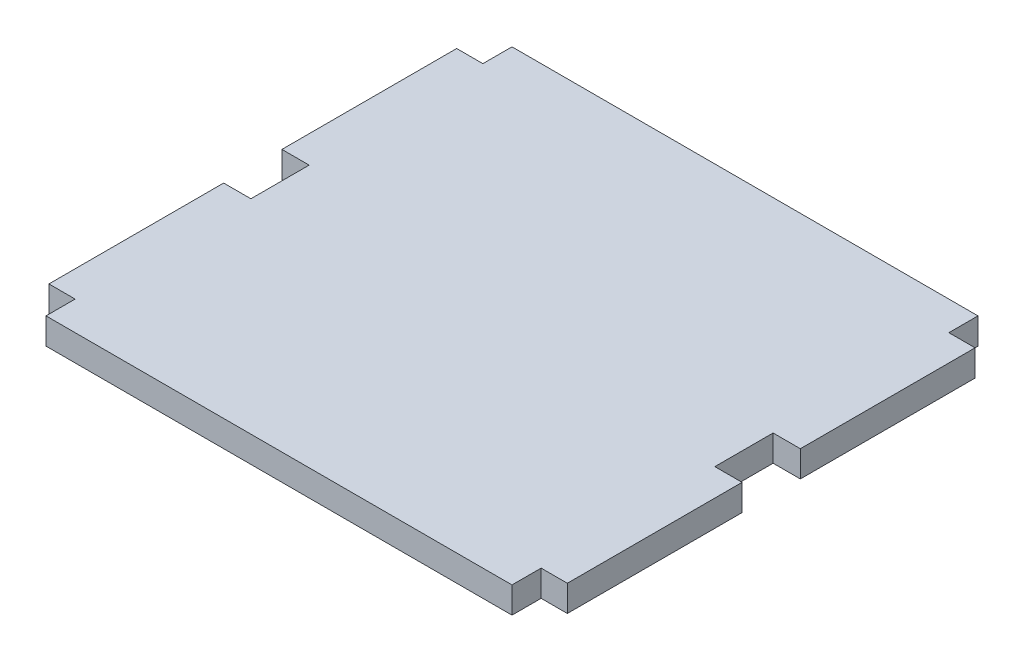
ISO-10303-21;
HEADER;
FILE_DESCRIPTION(('STEP AP214'),'2;1');
FILE_NAME('part.step','',(''),(''),'','','');
FILE_SCHEMA(('AUTOMOTIVE_DESIGN { 1 0 10303 214 1 1 1 1 }'));
ENDSEC;
DATA;
#1=APPLICATION_CONTEXT('core data for automotive mechanical design processes');
#2=APPLICATION_PROTOCOL_DEFINITION('international standard','automotive_design',2000,#1);
#3=PRODUCT_CONTEXT('',#1,'mechanical');
#4=PRODUCT('Part','Part','',(#3));
#5=PRODUCT_RELATED_PRODUCT_CATEGORY('part','',(#4));
#6=PRODUCT_DEFINITION_FORMATION('','',#4);
#7=PRODUCT_DEFINITION_CONTEXT('part definition',#1,'design');
#8=PRODUCT_DEFINITION('design','',#6,#7);
#9=PRODUCT_DEFINITION_SHAPE('','',#8);
#10=(LENGTH_UNIT() NAMED_UNIT(*) SI_UNIT(.MILLI.,.METRE.));
#11=(NAMED_UNIT(*) PLANE_ANGLE_UNIT() SI_UNIT($,.RADIAN.));
#12=(NAMED_UNIT(*) SI_UNIT($,.STERADIAN.) SOLID_ANGLE_UNIT());
#13=UNCERTAINTY_MEASURE_WITH_UNIT(LENGTH_MEASURE(1.E-05),#10,'distance_accuracy_value','');
#14=(GEOMETRIC_REPRESENTATION_CONTEXT(3) GLOBAL_UNCERTAINTY_ASSIGNED_CONTEXT((#13)) GLOBAL_UNIT_ASSIGNED_CONTEXT((#10,
#11,#12)) REPRESENTATION_CONTEXT('',''));
#15=CARTESIAN_POINT('',(0.,0.,0.));
#16=DIRECTION('',(0.,0.,1.));
#17=DIRECTION('',(1.,0.,0.));
#18=AXIS2_PLACEMENT_3D('',#15,#16,#17);
#19=CARTESIAN_POINT('',(-44.5,4.5,0.));
#20=DIRECTION('',(-1.,0.,0.));
#21=DIRECTION('',(0.,0.,1.));
#22=AXIS2_PLACEMENT_3D('',#19,#20,#21);
#23=PLANE('',#22);
#24=DIRECTION('',(0.,0.,-1.));
#25=VECTOR('',#24,1.);
#26=CARTESIAN_POINT('',(-44.5,0.,0.));
#27=LINE('',#26,#25);
#28=CARTESIAN_POINT('',(-44.5,0.,-5.));
#29=VERTEX_POINT('',#28);
#30=CARTESIAN_POINT('',(-44.5,0.,-35.));
#31=VERTEX_POINT('',#30);
#32=EDGE_CURVE('E212',#29,#31,#27,.T.);
#33=ORIENTED_EDGE('',*,*,#32,.F.);
#34=DIRECTION('',(0.,-1.,0.));
#35=VECTOR('',#34,1.);
#36=CARTESIAN_POINT('',(-44.5,4.5,-5.));
#37=LINE('',#36,#35);
#38=CARTESIAN_POINT('',(-44.5,4.5,-5.));
#39=VERTEX_POINT('',#38);
#40=EDGE_CURVE('E11',#39,#29,#37,.T.);
#41=ORIENTED_EDGE('',*,*,#40,.F.);
#42=DIRECTION('',(0.,0.,-1.));
#43=VECTOR('',#42,1.);
#44=CARTESIAN_POINT('',(-44.5,4.5,0.));
#45=LINE('',#44,#43);
#46=CARTESIAN_POINT('',(-44.5,4.5,-35.));
#47=VERTEX_POINT('',#46);
#48=EDGE_CURVE('E283',#39,#47,#45,.T.);
#49=ORIENTED_EDGE('',*,*,#48,.T.);
#50=DIRECTION('',(0.,-1.,0.));
#51=VECTOR('',#50,1.);
#52=CARTESIAN_POINT('',(-44.5,4.5,-35.));
#53=LINE('',#52,#51);
#54=EDGE_CURVE('E56',#47,#31,#53,.T.);
#55=ORIENTED_EDGE('',*,*,#54,.T.);
#56=EDGE_LOOP('',(#33,#41,#49,#55));
#57=FACE_BOUND('',#56,.T.);
#58=ADVANCED_FACE('F39',(#57),#23,.T.);
#59=CARTESIAN_POINT('',(0.,4.5,-5.));
#60=DIRECTION('',(0.,0.,-1.));
#61=DIRECTION('',(-1.,0.,0.));
#62=AXIS2_PLACEMENT_3D('',#59,#60,#61);
#63=PLANE('',#62);
#64=DIRECTION('',(1.,0.,0.));
#65=VECTOR('',#64,1.);
#66=CARTESIAN_POINT('',(0.,0.,-5.));
#67=LINE('',#66,#65);
#68=CARTESIAN_POINT('',(-39.8241412720848,0.,-5.));
#69=VERTEX_POINT('',#68);
#70=EDGE_CURVE('E215',#29,#69,#67,.T.);
#71=ORIENTED_EDGE('',*,*,#70,.T.);
#72=DIRECTION('',(0.,-1.,0.));
#73=VECTOR('',#72,1.);
#74=CARTESIAN_POINT('',(-39.8241412720848,4.5,-5.));
#75=LINE('',#74,#73);
#76=CARTESIAN_POINT('',(-39.8241412720848,4.5,-5.));
#77=VERTEX_POINT('',#76);
#78=EDGE_CURVE('E48',#77,#69,#75,.T.);
#79=ORIENTED_EDGE('',*,*,#78,.F.);
#80=DIRECTION('',(1.,0.,0.));
#81=VECTOR('',#80,1.);
#82=CARTESIAN_POINT('',(0.,4.5,-5.));
#83=LINE('',#82,#81);
#84=EDGE_CURVE('E365',#39,#77,#83,.T.);
#85=ORIENTED_EDGE('',*,*,#84,.F.);
#86=ORIENTED_EDGE('',*,*,#40,.T.);
#87=EDGE_LOOP('',(#71,#79,#85,#86));
#88=FACE_BOUND('',#87,.T.);
#89=ADVANCED_FACE('F423',(#88),#63,.F.);
#90=CARTESIAN_POINT('',(-39.8241412720814,4.5,2.75782820118983E-11));
#91=DIRECTION('',(1.,0.,-6.92501611609941E-13));
#92=DIRECTION('',(-6.92501611609941E-13,0.,-1.));
#93=AXIS2_PLACEMENT_3D('',#90,#91,#92);
#94=PLANE('',#93);
#95=DIRECTION('',(6.92501611609941E-13,0.,1.));
#96=VECTOR('',#95,1.);
#97=CARTESIAN_POINT('',(-39.8241412720814,0.,2.75782820118983E-11));
#98=LINE('',#97,#96);
#99=CARTESIAN_POINT('',(-39.8241412720848,0.,5.));
#100=VERTEX_POINT('',#99);
#101=EDGE_CURVE('E218',#69,#100,#98,.T.);
#102=ORIENTED_EDGE('',*,*,#101,.T.);
#103=DIRECTION('',(0.,-1.,0.));
#104=VECTOR('',#103,1.);
#105=CARTESIAN_POINT('',(-39.8241412720848,4.5,5.));
#106=LINE('',#105,#104);
#107=CARTESIAN_POINT('',(-39.8241412720848,4.5,5.));
#108=VERTEX_POINT('',#107);
#109=EDGE_CURVE('E333',#108,#100,#106,.T.);
#110=ORIENTED_EDGE('',*,*,#109,.F.);
#111=DIRECTION('',(6.92501611609941E-13,0.,1.));
#112=VECTOR('',#111,1.);
#113=CARTESIAN_POINT('',(-39.8241412720814,4.5,2.75782820118983E-11));
#114=LINE('',#113,#112);
#115=EDGE_CURVE('E343',#77,#108,#114,.T.);
#116=ORIENTED_EDGE('',*,*,#115,.F.);
#117=ORIENTED_EDGE('',*,*,#78,.T.);
#118=EDGE_LOOP('',(#102,#110,#116,#117));
#119=FACE_BOUND('',#118,.T.);
#120=ADVANCED_FACE('F341',(#119),#94,.F.);
#121=CARTESIAN_POINT('',(0.,4.5,4.99999999999997));
#122=DIRECTION('',(0.,0.,-1.));
#123=DIRECTION('',(-1.,0.,0.));
#124=AXIS2_PLACEMENT_3D('',#121,#122,#123);
#125=PLANE('',#124);
#126=DIRECTION('',(1.,0.,0.));
#127=VECTOR('',#126,1.);
#128=CARTESIAN_POINT('',(0.,0.,4.99999999999997));
#129=LINE('',#128,#127);
#130=CARTESIAN_POINT('',(-44.5,0.,5.));
#131=VERTEX_POINT('',#130);
#132=EDGE_CURVE('E222',#131,#100,#129,.T.);
#133=ORIENTED_EDGE('',*,*,#132,.F.);
#134=DIRECTION('',(0.,-1.,0.));
#135=VECTOR('',#134,1.);
#136=CARTESIAN_POINT('',(-44.5,4.5,5.));
#137=LINE('',#136,#135);
#138=CARTESIAN_POINT('',(-44.5,4.5,5.));
#139=VERTEX_POINT('',#138);
#140=EDGE_CURVE('E330',#139,#131,#137,.T.);
#141=ORIENTED_EDGE('',*,*,#140,.F.);
#142=DIRECTION('',(1.,0.,0.));
#143=VECTOR('',#142,1.);
#144=CARTESIAN_POINT('',(0.,4.5,4.99999999999997));
#145=LINE('',#144,#143);
#146=EDGE_CURVE('E355',#139,#108,#145,.T.);
#147=ORIENTED_EDGE('',*,*,#146,.T.);
#148=ORIENTED_EDGE('',*,*,#109,.T.);
#149=EDGE_LOOP('',(#133,#141,#147,#148));
#150=FACE_BOUND('',#149,.T.);
#151=ADVANCED_FACE('F352',(#150),#125,.T.);
#152=CARTESIAN_POINT('',(-44.5,4.5,0.));
#153=DIRECTION('',(-1.,0.,0.));
#154=DIRECTION('',(0.,0.,1.));
#155=AXIS2_PLACEMENT_3D('',#152,#153,#154);
#156=PLANE('',#155);
#157=DIRECTION('',(0.,0.,-1.));
#158=VECTOR('',#157,1.);
#159=CARTESIAN_POINT('',(-44.5,0.,0.));
#160=LINE('',#159,#158);
#161=CARTESIAN_POINT('',(-44.5,0.,35.));
#162=VERTEX_POINT('',#161);
#163=EDGE_CURVE('E226',#162,#131,#160,.T.);
#164=ORIENTED_EDGE('',*,*,#163,.F.);
#165=DIRECTION('',(0.,-1.,0.));
#166=VECTOR('',#165,1.);
#167=CARTESIAN_POINT('',(-44.5,4.5,35.));
#168=LINE('',#167,#166);
#169=CARTESIAN_POINT('',(-44.5,4.5,35.));
#170=VERTEX_POINT('',#169);
#171=EDGE_CURVE('E327',#170,#162,#168,.T.);
#172=ORIENTED_EDGE('',*,*,#171,.F.);
#173=DIRECTION('',(0.,0.,-1.));
#174=VECTOR('',#173,1.);
#175=CARTESIAN_POINT('',(-44.5,4.5,0.));
#176=LINE('',#175,#174);
#177=EDGE_CURVE('E359',#170,#139,#176,.T.);
#178=ORIENTED_EDGE('',*,*,#177,.T.);
#179=ORIENTED_EDGE('',*,*,#140,.T.);
#180=EDGE_LOOP('',(#164,#172,#178,#179));
#181=FACE_BOUND('',#180,.T.);
#182=ADVANCED_FACE('F434',(#181),#156,.T.);
#183=CARTESIAN_POINT('',(0.,4.5,35.));
#184=DIRECTION('',(0.,0.,-1.));
#185=DIRECTION('',(-1.,0.,0.));
#186=AXIS2_PLACEMENT_3D('',#183,#184,#185);
#187=PLANE('',#186);
#188=DIRECTION('',(1.,0.,0.));
#189=VECTOR('',#188,1.);
#190=CARTESIAN_POINT('',(0.,0.,35.));
#191=LINE('',#190,#189);
#192=CARTESIAN_POINT('',(-40.,0.,35.));
#193=VERTEX_POINT('',#192);
#194=EDGE_CURVE('E230',#162,#193,#191,.T.);
#195=ORIENTED_EDGE('',*,*,#194,.T.);
#196=DIRECTION('',(0.,-1.,0.));
#197=VECTOR('',#196,1.);
#198=CARTESIAN_POINT('',(-40.,4.5,35.));
#199=LINE('',#198,#197);
#200=CARTESIAN_POINT('',(-40.,4.5,35.));
#201=VERTEX_POINT('',#200);
#202=EDGE_CURVE('E324',#201,#193,#199,.T.);
#203=ORIENTED_EDGE('',*,*,#202,.F.);
#204=DIRECTION('',(1.,0.,0.));
#205=VECTOR('',#204,1.);
#206=CARTESIAN_POINT('',(0.,4.5,35.));
#207=LINE('',#206,#205);
#208=EDGE_CURVE('E363',#170,#201,#207,.T.);
#209=ORIENTED_EDGE('',*,*,#208,.F.);
#210=ORIENTED_EDGE('',*,*,#171,.T.);
#211=EDGE_LOOP('',(#195,#203,#209,#210));
#212=FACE_BOUND('',#211,.T.);
#213=ADVANCED_FACE('F437',(#212),#187,.F.);
#214=CARTESIAN_POINT('',(-40.,4.5,0.));
#215=DIRECTION('',(-1.,0.,0.));
#216=DIRECTION('',(0.,0.,1.));
#217=AXIS2_PLACEMENT_3D('',#214,#215,#216);
#218=PLANE('',#217);
#219=DIRECTION('',(0.,0.,-1.));
#220=VECTOR('',#219,1.);
#221=CARTESIAN_POINT('',(-40.,0.,0.));
#222=LINE('',#221,#220);
#223=CARTESIAN_POINT('',(-40.,0.,40.));
#224=VERTEX_POINT('',#223);
#225=EDGE_CURVE('E234',#224,#193,#222,.T.);
#226=ORIENTED_EDGE('',*,*,#225,.F.);
#227=DIRECTION('',(0.,-1.,0.));
#228=VECTOR('',#227,1.);
#229=CARTESIAN_POINT('',(-40.,4.5,40.));
#230=LINE('',#229,#228);
#231=CARTESIAN_POINT('',(-40.,4.5,40.));
#232=VERTEX_POINT('',#231);
#233=EDGE_CURVE('E321',#232,#224,#230,.T.);
#234=ORIENTED_EDGE('',*,*,#233,.F.);
#235=DIRECTION('',(0.,0.,-1.));
#236=VECTOR('',#235,1.);
#237=CARTESIAN_POINT('',(-40.,4.5,0.));
#238=LINE('',#237,#236);
#239=EDGE_CURVE('E371',#232,#201,#238,.T.);
#240=ORIENTED_EDGE('',*,*,#239,.T.);
#241=ORIENTED_EDGE('',*,*,#202,.T.);
#242=EDGE_LOOP('',(#226,#234,#240,#241));
#243=FACE_BOUND('',#242,.T.);
#244=ADVANCED_FACE('F441',(#243),#218,.T.);
#245=CARTESIAN_POINT('',(0.,4.5,40.));
#246=DIRECTION('',(0.,0.,-1.));
#247=DIRECTION('',(-1.,0.,0.));
#248=AXIS2_PLACEMENT_3D('',#245,#246,#247);
#249=PLANE('',#248);
#250=DIRECTION('',(1.,0.,0.));
#251=VECTOR('',#250,1.);
#252=CARTESIAN_POINT('',(0.,0.,40.));
#253=LINE('',#252,#251);
#254=CARTESIAN_POINT('',(40.,0.,40.));
#255=VERTEX_POINT('',#254);
#256=EDGE_CURVE('E238',#224,#255,#253,.T.);
#257=ORIENTED_EDGE('',*,*,#256,.T.);
#258=DIRECTION('',(0.,-1.,0.));
#259=VECTOR('',#258,1.);
#260=CARTESIAN_POINT('',(40.,4.5,40.));
#261=LINE('',#260,#259);
#262=CARTESIAN_POINT('',(40.,4.5,40.));
#263=VERTEX_POINT('',#262);
#264=EDGE_CURVE('E317',#263,#255,#261,.T.);
#265=ORIENTED_EDGE('',*,*,#264,.F.);
#266=DIRECTION('',(1.,0.,0.));
#267=VECTOR('',#266,1.);
#268=CARTESIAN_POINT('',(0.,4.5,40.));
#269=LINE('',#268,#267);
#270=EDGE_CURVE('E375',#232,#263,#269,.T.);
#271=ORIENTED_EDGE('',*,*,#270,.F.);
#272=ORIENTED_EDGE('',*,*,#233,.T.);
#273=EDGE_LOOP('',(#257,#265,#271,#272));
#274=FACE_BOUND('',#273,.T.);
#275=ADVANCED_FACE('F445',(#274),#249,.F.);
#276=CARTESIAN_POINT('',(40.,4.5,0.));
#277=DIRECTION('',(-1.,0.,0.));
#278=DIRECTION('',(0.,0.,1.));
#279=AXIS2_PLACEMENT_3D('',#276,#277,#278);
#280=PLANE('',#279);
#281=DIRECTION('',(0.,0.,-1.));
#282=VECTOR('',#281,1.);
#283=CARTESIAN_POINT('',(40.,0.,0.));
#284=LINE('',#283,#282);
#285=CARTESIAN_POINT('',(40.,0.,35.));
#286=VERTEX_POINT('',#285);
#287=EDGE_CURVE('E241',#255,#286,#284,.T.);
#288=ORIENTED_EDGE('',*,*,#287,.T.);
#289=DIRECTION('',(0.,-1.,0.));
#290=VECTOR('',#289,1.);
#291=CARTESIAN_POINT('',(40.,4.5,35.));
#292=LINE('',#291,#290);
#293=CARTESIAN_POINT('',(40.,4.5,35.));
#294=VERTEX_POINT('',#293);
#295=EDGE_CURVE('E314',#294,#286,#292,.T.);
#296=ORIENTED_EDGE('',*,*,#295,.F.);
#297=DIRECTION('',(0.,0.,-1.));
#298=VECTOR('',#297,1.);
#299=CARTESIAN_POINT('',(40.,4.5,0.));
#300=LINE('',#299,#298);
#301=EDGE_CURVE('E378',#263,#294,#300,.T.);
#302=ORIENTED_EDGE('',*,*,#301,.F.);
#303=ORIENTED_EDGE('',*,*,#264,.T.);
#304=EDGE_LOOP('',(#288,#296,#302,#303));
#305=FACE_BOUND('',#304,.T.);
#306=ADVANCED_FACE('F449',(#305),#280,.F.);
#307=CARTESIAN_POINT('',(0.,4.5,35.));
#308=DIRECTION('',(0.,0.,1.));
#309=DIRECTION('',(1.,0.,0.));
#310=AXIS2_PLACEMENT_3D('',#307,#308,#309);
#311=PLANE('',#310);
#312=DIRECTION('',(-1.,0.,0.));
#313=VECTOR('',#312,1.);
#314=CARTESIAN_POINT('',(0.,0.,35.));
#315=LINE('',#314,#313);
#316=CARTESIAN_POINT('',(44.5,0.,35.));
#317=VERTEX_POINT('',#316);
#318=EDGE_CURVE('E245',#317,#286,#315,.T.);
#319=ORIENTED_EDGE('',*,*,#318,.F.);
#320=DIRECTION('',(0.,-1.,0.));
#321=VECTOR('',#320,1.);
#322=CARTESIAN_POINT('',(44.5,4.5,35.));
#323=LINE('',#322,#321);
#324=CARTESIAN_POINT('',(44.5,4.5,35.));
#325=VERTEX_POINT('',#324);
#326=EDGE_CURVE('E311',#325,#317,#323,.T.);
#327=ORIENTED_EDGE('',*,*,#326,.F.);
#328=DIRECTION('',(-1.,0.,0.));
#329=VECTOR('',#328,1.);
#330=CARTESIAN_POINT('',(0.,4.5,35.));
#331=LINE('',#330,#329);
#332=EDGE_CURVE('E381',#325,#294,#331,.T.);
#333=ORIENTED_EDGE('',*,*,#332,.T.);
#334=ORIENTED_EDGE('',*,*,#295,.T.);
#335=EDGE_LOOP('',(#319,#327,#333,#334));
#336=FACE_BOUND('',#335,.T.);
#337=ADVANCED_FACE('F453',(#336),#311,.T.);
#338=CARTESIAN_POINT('',(44.5,4.5,0.));
#339=DIRECTION('',(-1.,0.,0.));
#340=DIRECTION('',(0.,0.,1.));
#341=AXIS2_PLACEMENT_3D('',#338,#339,#340);
#342=PLANE('',#341);
#343=DIRECTION('',(0.,0.,-1.));
#344=VECTOR('',#343,1.);
#345=CARTESIAN_POINT('',(44.5,0.,0.));
#346=LINE('',#345,#344);
#347=CARTESIAN_POINT('',(44.5,0.,5.));
#348=VERTEX_POINT('',#347);
#349=EDGE_CURVE('E249',#317,#348,#346,.T.);
#350=ORIENTED_EDGE('',*,*,#349,.T.);
#351=DIRECTION('',(0.,-1.,0.));
#352=VECTOR('',#351,1.);
#353=CARTESIAN_POINT('',(44.5,4.5,5.));
#354=LINE('',#353,#352);
#355=CARTESIAN_POINT('',(44.5,4.5,5.));
#356=VERTEX_POINT('',#355);
#357=EDGE_CURVE('E307',#356,#348,#354,.T.);
#358=ORIENTED_EDGE('',*,*,#357,.F.);
#359=DIRECTION('',(0.,0.,-1.));
#360=VECTOR('',#359,1.);
#361=CARTESIAN_POINT('',(44.5,4.5,0.));
#362=LINE('',#361,#360);
#363=EDGE_CURVE('E385',#325,#356,#362,.T.);
#364=ORIENTED_EDGE('',*,*,#363,.F.);
#365=ORIENTED_EDGE('',*,*,#326,.T.);
#366=EDGE_LOOP('',(#350,#358,#364,#365));
#367=FACE_BOUND('',#366,.T.);
#368=ADVANCED_FACE('F457',(#367),#342,.F.);
#369=CARTESIAN_POINT('',(0.,4.5,4.99999999999997));
#370=DIRECTION('',(0.,0.,1.));
#371=DIRECTION('',(1.,0.,0.));
#372=AXIS2_PLACEMENT_3D('',#369,#370,#371);
#373=PLANE('',#372);
#374=DIRECTION('',(-1.,0.,0.));
#375=VECTOR('',#374,1.);
#376=CARTESIAN_POINT('',(0.,0.,4.99999999999997));
#377=LINE('',#376,#375);
#378=CARTESIAN_POINT('',(39.8241412720848,0.,5.));
#379=VERTEX_POINT('',#378);
#380=EDGE_CURVE('E252',#348,#379,#377,.T.);
#381=ORIENTED_EDGE('',*,*,#380,.T.);
#382=DIRECTION('',(0.,-1.,0.));
#383=VECTOR('',#382,1.);
#384=CARTESIAN_POINT('',(39.8241412720848,4.5,5.));
#385=LINE('',#384,#383);
#386=CARTESIAN_POINT('',(39.8241412720848,4.5,5.));
#387=VERTEX_POINT('',#386);
#388=EDGE_CURVE('E303',#387,#379,#385,.T.);
#389=ORIENTED_EDGE('',*,*,#388,.F.);
#390=DIRECTION('',(-1.,0.,0.));
#391=VECTOR('',#390,1.);
#392=CARTESIAN_POINT('',(0.,4.5,4.99999999999997));
#393=LINE('',#392,#391);
#394=EDGE_CURVE('E388',#356,#387,#393,.T.);
#395=ORIENTED_EDGE('',*,*,#394,.F.);
#396=ORIENTED_EDGE('',*,*,#357,.T.);
#397=EDGE_LOOP('',(#381,#389,#395,#396));
#398=FACE_BOUND('',#397,.T.);
#399=ADVANCED_FACE('F461',(#398),#373,.F.);
#400=CARTESIAN_POINT('',(39.8241412720814,4.5,-2.75782820118983E-11));
#401=DIRECTION('',(-1.,0.,6.92501611609941E-13));
#402=DIRECTION('',(6.92501611609941E-13,0.,1.));
#403=AXIS2_PLACEMENT_3D('',#400,#401,#402);
#404=PLANE('',#403);
#405=DIRECTION('',(-6.92501611609941E-13,0.,-1.));
#406=VECTOR('',#405,1.);
#407=CARTESIAN_POINT('',(39.8241412720814,0.,-2.75782820118983E-11));
#408=LINE('',#407,#406);
#409=CARTESIAN_POINT('',(39.8241412720848,0.,-5.));
#410=VERTEX_POINT('',#409);
#411=EDGE_CURVE('E255',#379,#410,#408,.T.);
#412=ORIENTED_EDGE('',*,*,#411,.T.);
#413=DIRECTION('',(0.,-1.,0.));
#414=VECTOR('',#413,1.);
#415=CARTESIAN_POINT('',(39.8241412720848,4.5,-5.));
#416=LINE('',#415,#414);
#417=CARTESIAN_POINT('',(39.8241412720848,4.5,-5.));
#418=VERTEX_POINT('',#417);
#419=EDGE_CURVE('E300',#418,#410,#416,.T.);
#420=ORIENTED_EDGE('',*,*,#419,.F.);
#421=DIRECTION('',(-6.92501611609941E-13,0.,-1.));
#422=VECTOR('',#421,1.);
#423=CARTESIAN_POINT('',(39.8241412720814,4.5,-2.75782820118983E-11));
#424=LINE('',#423,#422);
#425=EDGE_CURVE('E391',#387,#418,#424,.T.);
#426=ORIENTED_EDGE('',*,*,#425,.F.);
#427=ORIENTED_EDGE('',*,*,#388,.T.);
#428=EDGE_LOOP('',(#412,#420,#426,#427));
#429=FACE_BOUND('',#428,.T.);
#430=ADVANCED_FACE('F465',(#429),#404,.F.);
#431=CARTESIAN_POINT('',(0.,4.5,-5.));
#432=DIRECTION('',(0.,0.,1.));
#433=DIRECTION('',(1.,0.,0.));
#434=AXIS2_PLACEMENT_3D('',#431,#432,#433);
#435=PLANE('',#434);
#436=DIRECTION('',(-1.,0.,0.));
#437=VECTOR('',#436,1.);
#438=CARTESIAN_POINT('',(0.,0.,-5.));
#439=LINE('',#438,#437);
#440=CARTESIAN_POINT('',(44.5,0.,-5.));
#441=VERTEX_POINT('',#440);
#442=EDGE_CURVE('E259',#441,#410,#439,.T.);
#443=ORIENTED_EDGE('',*,*,#442,.F.);
#444=DIRECTION('',(0.,-1.,0.));
#445=VECTOR('',#444,1.);
#446=CARTESIAN_POINT('',(44.5,4.5,-5.));
#447=LINE('',#446,#445);
#448=CARTESIAN_POINT('',(44.5,4.5,-5.));
#449=VERTEX_POINT('',#448);
#450=EDGE_CURVE('E297',#449,#441,#447,.T.);
#451=ORIENTED_EDGE('',*,*,#450,.F.);
#452=DIRECTION('',(-1.,0.,0.));
#453=VECTOR('',#452,1.);
#454=CARTESIAN_POINT('',(0.,4.5,-5.));
#455=LINE('',#454,#453);
#456=EDGE_CURVE('E394',#449,#418,#455,.T.);
#457=ORIENTED_EDGE('',*,*,#456,.T.);
#458=ORIENTED_EDGE('',*,*,#419,.T.);
#459=EDGE_LOOP('',(#443,#451,#457,#458));
#460=FACE_BOUND('',#459,.T.);
#461=ADVANCED_FACE('F469',(#460),#435,.T.);
#462=CARTESIAN_POINT('',(44.5,4.5,0.));
#463=DIRECTION('',(-1.,0.,0.));
#464=DIRECTION('',(0.,0.,1.));
#465=AXIS2_PLACEMENT_3D('',#462,#463,#464);
#466=PLANE('',#465);
#467=DIRECTION('',(0.,0.,-1.));
#468=VECTOR('',#467,1.);
#469=CARTESIAN_POINT('',(44.5,0.,0.));
#470=LINE('',#469,#468);
#471=CARTESIAN_POINT('',(44.5,0.,-35.));
#472=VERTEX_POINT('',#471);
#473=EDGE_CURVE('E263',#441,#472,#470,.T.);
#474=ORIENTED_EDGE('',*,*,#473,.T.);
#475=DIRECTION('',(0.,-1.,0.));
#476=VECTOR('',#475,1.);
#477=CARTESIAN_POINT('',(44.5,4.5,-35.));
#478=LINE('',#477,#476);
#479=CARTESIAN_POINT('',(44.5,4.5,-35.));
#480=VERTEX_POINT('',#479);
#481=EDGE_CURVE('E293',#480,#472,#478,.T.);
#482=ORIENTED_EDGE('',*,*,#481,.F.);
#483=DIRECTION('',(0.,0.,-1.));
#484=VECTOR('',#483,1.);
#485=CARTESIAN_POINT('',(44.5,4.5,0.));
#486=LINE('',#485,#484);
#487=EDGE_CURVE('E398',#449,#480,#486,.T.);
#488=ORIENTED_EDGE('',*,*,#487,.F.);
#489=ORIENTED_EDGE('',*,*,#450,.T.);
#490=EDGE_LOOP('',(#474,#482,#488,#489));
#491=FACE_BOUND('',#490,.T.);
#492=ADVANCED_FACE('F473',(#491),#466,.F.);
#493=CARTESIAN_POINT('',(0.,4.5,-35.));
#494=DIRECTION('',(0.,0.,1.));
#495=DIRECTION('',(1.,0.,0.));
#496=AXIS2_PLACEMENT_3D('',#493,#494,#495);
#497=PLANE('',#496);
#498=DIRECTION('',(-1.,0.,0.));
#499=VECTOR('',#498,1.);
#500=CARTESIAN_POINT('',(0.,0.,-35.));
#501=LINE('',#500,#499);
#502=CARTESIAN_POINT('',(40.,0.,-35.));
#503=VERTEX_POINT('',#502);
#504=EDGE_CURVE('E266',#472,#503,#501,.T.);
#505=ORIENTED_EDGE('',*,*,#504,.T.);
#506=DIRECTION('',(0.,-1.,0.));
#507=VECTOR('',#506,1.);
#508=CARTESIAN_POINT('',(40.,4.5,-35.));
#509=LINE('',#508,#507);
#510=CARTESIAN_POINT('',(40.,4.5,-35.));
#511=VERTEX_POINT('',#510);
#512=EDGE_CURVE('E290',#511,#503,#509,.T.);
#513=ORIENTED_EDGE('',*,*,#512,.F.);
#514=DIRECTION('',(-1.,0.,0.));
#515=VECTOR('',#514,1.);
#516=CARTESIAN_POINT('',(0.,4.5,-35.));
#517=LINE('',#516,#515);
#518=EDGE_CURVE('E206',#480,#511,#517,.T.);
#519=ORIENTED_EDGE('',*,*,#518,.F.);
#520=ORIENTED_EDGE('',*,*,#481,.T.);
#521=EDGE_LOOP('',(#505,#513,#519,#520));
#522=FACE_BOUND('',#521,.T.);
#523=ADVANCED_FACE('F407',(#522),#497,.F.);
#524=CARTESIAN_POINT('',(40.,4.5,0.));
#525=DIRECTION('',(1.,0.,0.));
#526=DIRECTION('',(0.,0.,-1.));
#527=AXIS2_PLACEMENT_3D('',#524,#525,#526);
#528=PLANE('',#527);
#529=DIRECTION('',(0.,0.,1.));
#530=VECTOR('',#529,1.);
#531=CARTESIAN_POINT('',(40.,0.,0.));
#532=LINE('',#531,#530);
#533=CARTESIAN_POINT('',(40.,0.,-40.));
#534=VERTEX_POINT('',#533);
#535=EDGE_CURVE('E270',#534,#503,#532,.T.);
#536=ORIENTED_EDGE('',*,*,#535,.F.);
#537=DIRECTION('',(0.,-1.,0.));
#538=VECTOR('',#537,1.);
#539=CARTESIAN_POINT('',(40.,4.5,-40.));
#540=LINE('',#539,#538);
#541=CARTESIAN_POINT('',(40.,4.5,-40.));
#542=VERTEX_POINT('',#541);
#543=EDGE_CURVE('E189',#542,#534,#540,.T.);
#544=ORIENTED_EDGE('',*,*,#543,.F.);
#545=DIRECTION('',(0.,0.,1.));
#546=VECTOR('',#545,1.);
#547=CARTESIAN_POINT('',(40.,4.5,0.));
#548=LINE('',#547,#546);
#549=EDGE_CURVE('E202',#542,#511,#548,.T.);
#550=ORIENTED_EDGE('',*,*,#549,.T.);
#551=ORIENTED_EDGE('',*,*,#512,.T.);
#552=EDGE_LOOP('',(#536,#544,#550,#551));
#553=FACE_BOUND('',#552,.T.);
#554=ADVANCED_FACE('F411',(#553),#528,.T.);
#555=CARTESIAN_POINT('',(0.,4.5,-40.));
#556=DIRECTION('',(0.,0.,-1.));
#557=DIRECTION('',(-1.,0.,0.));
#558=AXIS2_PLACEMENT_3D('',#555,#556,#557);
#559=PLANE('',#558);
#560=DIRECTION('',(1.,0.,0.));
#561=VECTOR('',#560,1.);
#562=CARTESIAN_POINT('',(0.,0.,-40.));
#563=LINE('',#562,#561);
#564=CARTESIAN_POINT('',(-40.,0.,-40.));
#565=VERTEX_POINT('',#564);
#566=EDGE_CURVE('E185',#565,#534,#563,.T.);
#567=ORIENTED_EDGE('',*,*,#566,.F.);
#568=DIRECTION('',(0.,-1.,0.));
#569=VECTOR('',#568,1.);
#570=CARTESIAN_POINT('',(-40.,4.5,-40.));
#571=LINE('',#570,#569);
#572=CARTESIAN_POINT('',(-40.,4.5,-40.));
#573=VERTEX_POINT('',#572);
#574=EDGE_CURVE('E179',#573,#565,#571,.T.);
#575=ORIENTED_EDGE('',*,*,#574,.F.);
#576=DIRECTION('',(1.,0.,0.));
#577=VECTOR('',#576,1.);
#578=CARTESIAN_POINT('',(0.,4.5,-40.));
#579=LINE('',#578,#577);
#580=EDGE_CURVE('E183',#573,#542,#579,.T.);
#581=ORIENTED_EDGE('',*,*,#580,.T.);
#582=ORIENTED_EDGE('',*,*,#543,.T.);
#583=EDGE_LOOP('',(#567,#575,#581,#582));
#584=FACE_BOUND('',#583,.T.);
#585=ADVANCED_FACE('F181',(#584),#559,.T.);
#586=CARTESIAN_POINT('',(-40.,4.5,0.));
#587=DIRECTION('',(1.,0.,0.));
#588=DIRECTION('',(0.,0.,-1.));
#589=AXIS2_PLACEMENT_3D('',#586,#587,#588);
#590=PLANE('',#589);
#591=DIRECTION('',(0.,0.,1.));
#592=VECTOR('',#591,1.);
#593=CARTESIAN_POINT('',(-40.,0.,0.));
#594=LINE('',#593,#592);
#595=CARTESIAN_POINT('',(-40.,0.,-35.));
#596=VERTEX_POINT('',#595);
#597=EDGE_CURVE('E276',#565,#596,#594,.T.);
#598=ORIENTED_EDGE('',*,*,#597,.T.);
#599=DIRECTION('',(0.,-1.,0.));
#600=VECTOR('',#599,1.);
#601=CARTESIAN_POINT('',(-40.,4.5,-35.));
#602=LINE('',#601,#600);
#603=CARTESIAN_POINT('',(-40.,4.5,-35.));
#604=VERTEX_POINT('',#603);
#605=EDGE_CURVE('E118',#604,#596,#602,.T.);
#606=ORIENTED_EDGE('',*,*,#605,.F.);
#607=DIRECTION('',(0.,0.,1.));
#608=VECTOR('',#607,1.);
#609=CARTESIAN_POINT('',(-40.,4.5,0.));
#610=LINE('',#609,#608);
#611=EDGE_CURVE('E191',#573,#604,#610,.T.);
#612=ORIENTED_EDGE('',*,*,#611,.F.);
#613=ORIENTED_EDGE('',*,*,#574,.T.);
#614=EDGE_LOOP('',(#598,#606,#612,#613));
#615=FACE_BOUND('',#614,.T.);
#616=ADVANCED_FACE('F192',(#615),#590,.F.);
#617=CARTESIAN_POINT('',(0.,4.5,-35.));
#618=DIRECTION('',(0.,0.,-1.));
#619=DIRECTION('',(-1.,0.,0.));
#620=AXIS2_PLACEMENT_3D('',#617,#618,#619);
#621=PLANE('',#620);
#622=DIRECTION('',(1.,0.,0.));
#623=VECTOR('',#622,1.);
#624=CARTESIAN_POINT('',(0.,0.,-35.));
#625=LINE('',#624,#623);
#626=EDGE_CURVE('E279',#31,#596,#625,.T.);
#627=ORIENTED_EDGE('',*,*,#626,.F.);
#628=ORIENTED_EDGE('',*,*,#54,.F.);
#629=DIRECTION('',(1.,0.,0.));
#630=VECTOR('',#629,1.);
#631=CARTESIAN_POINT('',(0.,4.5,-35.));
#632=LINE('',#631,#630);
#633=EDGE_CURVE('E196',#47,#604,#632,.T.);
#634=ORIENTED_EDGE('',*,*,#633,.T.);
#635=ORIENTED_EDGE('',*,*,#605,.T.);
#636=EDGE_LOOP('',(#627,#628,#634,#635));
#637=FACE_BOUND('',#636,.T.);
#638=ADVANCED_FACE('F412',(#637),#621,.T.);
#639=CARTESIAN_POINT('',(0.,4.5,0.));
#640=DIRECTION('',(0.,1.,0.));
#641=DIRECTION('',(0.,0.,1.));
#642=AXIS2_PLACEMENT_3D('',#639,#640,#641);
#643=PLANE('',#642);
#644=ORIENTED_EDGE('',*,*,#48,.F.);
#645=ORIENTED_EDGE('',*,*,#84,.T.);
#646=ORIENTED_EDGE('',*,*,#115,.T.);
#647=ORIENTED_EDGE('',*,*,#146,.F.);
#648=ORIENTED_EDGE('',*,*,#177,.F.);
#649=ORIENTED_EDGE('',*,*,#208,.T.);
#650=ORIENTED_EDGE('',*,*,#239,.F.);
#651=ORIENTED_EDGE('',*,*,#270,.T.);
#652=ORIENTED_EDGE('',*,*,#301,.T.);
#653=ORIENTED_EDGE('',*,*,#332,.F.);
#654=ORIENTED_EDGE('',*,*,#363,.T.);
#655=ORIENTED_EDGE('',*,*,#394,.T.);
#656=ORIENTED_EDGE('',*,*,#425,.T.);
#657=ORIENTED_EDGE('',*,*,#456,.F.);
#658=ORIENTED_EDGE('',*,*,#487,.T.);
#659=ORIENTED_EDGE('',*,*,#518,.T.);
#660=ORIENTED_EDGE('',*,*,#549,.F.);
#661=ORIENTED_EDGE('',*,*,#580,.F.);
#662=ORIENTED_EDGE('',*,*,#611,.T.);
#663=ORIENTED_EDGE('',*,*,#633,.F.);
#664=EDGE_LOOP('',(#644,#645,#646,#647,#648,#649,#650,#651,#652,#653,#654,#655,#656,#657,#658,
#659,#660,#661,#662,#663));
#665=FACE_BOUND('',#664,.T.);
#666=ADVANCED_FACE('F200',(#665),#643,.T.);
#667=CARTESIAN_POINT('',(0.,0.,0.));
#668=DIRECTION('',(0.,1.,0.));
#669=DIRECTION('',(0.,0.,1.));
#670=AXIS2_PLACEMENT_3D('',#667,#668,#669);
#671=PLANE('',#670);
#672=ORIENTED_EDGE('',*,*,#32,.T.);
#673=ORIENTED_EDGE('',*,*,#626,.T.);
#674=ORIENTED_EDGE('',*,*,#597,.F.);
#675=ORIENTED_EDGE('',*,*,#566,.T.);
#676=ORIENTED_EDGE('',*,*,#535,.T.);
#677=ORIENTED_EDGE('',*,*,#504,.F.);
#678=ORIENTED_EDGE('',*,*,#473,.F.);
#679=ORIENTED_EDGE('',*,*,#442,.T.);
#680=ORIENTED_EDGE('',*,*,#411,.F.);
#681=ORIENTED_EDGE('',*,*,#380,.F.);
#682=ORIENTED_EDGE('',*,*,#349,.F.);
#683=ORIENTED_EDGE('',*,*,#318,.T.);
#684=ORIENTED_EDGE('',*,*,#287,.F.);
#685=ORIENTED_EDGE('',*,*,#256,.F.);
#686=ORIENTED_EDGE('',*,*,#225,.T.);
#687=ORIENTED_EDGE('',*,*,#194,.F.);
#688=ORIENTED_EDGE('',*,*,#163,.T.);
#689=ORIENTED_EDGE('',*,*,#132,.T.);
#690=ORIENTED_EDGE('',*,*,#101,.F.);
#691=ORIENTED_EDGE('',*,*,#70,.F.);
#692=EDGE_LOOP('',(#672,#673,#674,#675,#676,#677,#678,#679,#680,#681,#682,#683,#684,#685,#686,
#687,#688,#689,#690,#691));
#693=FACE_BOUND('',#692,.T.);
#694=ADVANCED_FACE('F347',(#693),#671,.F.);
#695=CLOSED_SHELL('',(#58,#89,#120,#151,#182,#213,#244,#275,#306,#337,#368,#399,#430,#461,#492,
#523,#554,#585,#616,#638,#666,#694));
#696=MANIFOLD_SOLID_BREP('B2',#695);
#697=ADVANCED_BREP_SHAPE_REPRESENTATION('',(#18,#696),#14);
#698=SHAPE_DEFINITION_REPRESENTATION(#9,#697);
ENDSEC;
END-ISO-10303-21;
